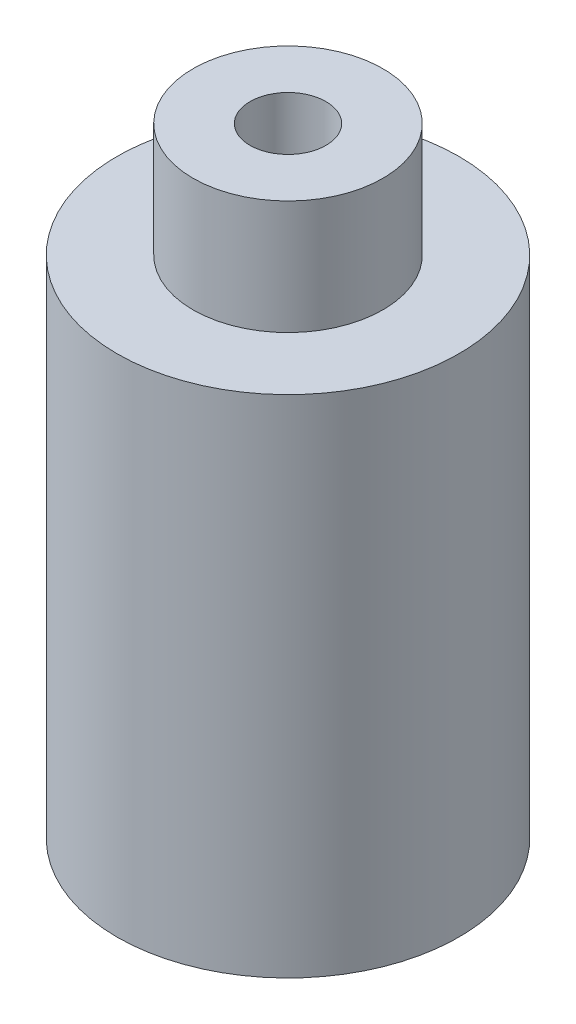
ISO-10303-21;
HEADER;
FILE_DESCRIPTION(('STEP AP214'),'2;1');
FILE_NAME('part.step','',(''),(''),'','','');
FILE_SCHEMA(('AUTOMOTIVE_DESIGN { 1 0 10303 214 1 1 1 1 }'));
ENDSEC;
DATA;
#1=APPLICATION_CONTEXT('core data for automotive mechanical design processes');
#2=APPLICATION_PROTOCOL_DEFINITION('international standard','automotive_design',2000,#1);
#3=PRODUCT_CONTEXT('',#1,'mechanical');
#4=PRODUCT('Part','Part','',(#3));
#5=PRODUCT_RELATED_PRODUCT_CATEGORY('part','',(#4));
#6=PRODUCT_DEFINITION_FORMATION('','',#4);
#7=PRODUCT_DEFINITION_CONTEXT('part definition',#1,'design');
#8=PRODUCT_DEFINITION('design','',#6,#7);
#9=PRODUCT_DEFINITION_SHAPE('','',#8);
#10=(LENGTH_UNIT() NAMED_UNIT(*) SI_UNIT(.MILLI.,.METRE.));
#11=(NAMED_UNIT(*) PLANE_ANGLE_UNIT() SI_UNIT($,.RADIAN.));
#12=(NAMED_UNIT(*) SI_UNIT($,.STERADIAN.) SOLID_ANGLE_UNIT());
#13=UNCERTAINTY_MEASURE_WITH_UNIT(LENGTH_MEASURE(1.E-05),#10,'distance_accuracy_value','');
#14=(GEOMETRIC_REPRESENTATION_CONTEXT(3) GLOBAL_UNCERTAINTY_ASSIGNED_CONTEXT((#13)) GLOBAL_UNIT_ASSIGNED_CONTEXT((#10,
#11,#12)) REPRESENTATION_CONTEXT('',''));
#15=CARTESIAN_POINT('',(0.,0.,0.));
#16=DIRECTION('',(0.,0.,1.));
#17=DIRECTION('',(1.,0.,0.));
#18=AXIS2_PLACEMENT_3D('',#15,#16,#17);
#19=CARTESIAN_POINT('',(18.,-36.7,0.));
#20=DIRECTION('',(0.,1.,0.));
#21=DIRECTION('',(0.,0.,1.));
#22=AXIS2_PLACEMENT_3D('',#19,#20,#21);
#23=CYLINDRICAL_SURFACE('',#22,1.);
#24=DIRECTION('',(0.,1.,0.));
#25=VECTOR('',#24,1.);
#26=CARTESIAN_POINT('',(18.,-36.7,1.));
#27=LINE('',#26,#25);
#28=CARTESIAN_POINT('',(18.,-24.,1.));
#29=VERTEX_POINT('',#28);
#30=CARTESIAN_POINT('',(18.,-19.5,1.));
#31=VERTEX_POINT('',#30);
#32=EDGE_CURVE('E10',#29,#31,#27,.T.);
#33=ORIENTED_EDGE('',*,*,#32,.F.);
#34=CARTESIAN_POINT('',(18.,-24.,0.));
#35=DIRECTION('',(0.,1.,0.));
#36=DIRECTION('',(0.,0.,1.));
#37=AXIS2_PLACEMENT_3D('',#34,#35,#36);
#38=CIRCLE('',#37,1.);
#39=EDGE_CURVE('E19',#29,#29,#38,.T.);
#40=ORIENTED_EDGE('',*,*,#39,.F.);
#41=ORIENTED_EDGE('',*,*,#32,.T.);
#42=CARTESIAN_POINT('',(18.,-19.5,0.));
#43=DIRECTION('',(0.,1.,0.));
#44=DIRECTION('',(0.,0.,1.));
#45=AXIS2_PLACEMENT_3D('',#42,#43,#44);
#46=CIRCLE('',#45,1.);
#47=EDGE_CURVE('E92',#31,#31,#46,.T.);
#48=ORIENTED_EDGE('',*,*,#47,.T.);
#49=EDGE_LOOP('',(#33,#40,#41,#48));
#50=FACE_BOUND('',#49,.T.);
#51=ADVANCED_FACE('F15',(#50),#23,.F.);
#52=CARTESIAN_POINT('',(18.,-24.,0.));
#53=DIRECTION('',(0.,1.,0.));
#54=DIRECTION('',(1.,0.,0.));
#55=AXIS2_PLACEMENT_3D('',#52,#53,#54);
#56=PLANE('',#55);
#57=ORIENTED_EDGE('',*,*,#39,.T.);
#58=EDGE_LOOP('',(#57));
#59=FACE_BOUND('',#58,.T.);
#60=CARTESIAN_POINT('',(18.,-24.,0.));
#61=DIRECTION('',(0.,1.,0.));
#62=DIRECTION('',(0.,0.,1.));
#63=AXIS2_PLACEMENT_3D('',#60,#61,#62);
#64=CIRCLE('',#63,2.);
#65=CARTESIAN_POINT('',(18.,-24.,2.));
#66=VERTEX_POINT('',#65);
#67=EDGE_CURVE('E68',#66,#66,#64,.T.);
#68=ORIENTED_EDGE('',*,*,#67,.F.);
#69=EDGE_LOOP('',(#68));
#70=FACE_BOUND('',#69,.T.);
#71=ADVANCED_FACE('F17',(#59,#70),#56,.F.);
#72=CARTESIAN_POINT('',(18.,-19.5,0.));
#73=DIRECTION('',(0.,1.,0.));
#74=DIRECTION('',(1.,0.,0.));
#75=AXIS2_PLACEMENT_3D('',#72,#73,#74);
#76=PLANE('',#75);
#77=ORIENTED_EDGE('',*,*,#47,.F.);
#78=EDGE_LOOP('',(#77));
#79=FACE_BOUND('',#78,.T.);
#80=CARTESIAN_POINT('',(18.,-19.5,0.));
#81=DIRECTION('',(0.,1.,0.));
#82=DIRECTION('',(0.,0.,1.));
#83=AXIS2_PLACEMENT_3D('',#80,#81,#82);
#84=CIRCLE('',#83,2.5);
#85=CARTESIAN_POINT('',(18.,-19.5,2.5));
#86=VERTEX_POINT('',#85);
#87=EDGE_CURVE('E76',#86,#86,#84,.T.);
#88=ORIENTED_EDGE('',*,*,#87,.T.);
#89=EDGE_LOOP('',(#88));
#90=FACE_BOUND('',#89,.T.);
#91=ADVANCED_FACE('F136',(#79,#90),#76,.T.);
#92=CARTESIAN_POINT('',(18.,-36.7,0.));
#93=DIRECTION('',(0.,1.,0.));
#94=DIRECTION('',(0.,0.,1.));
#95=AXIS2_PLACEMENT_3D('',#92,#93,#94);
#96=CYLINDRICAL_SURFACE('',#95,2.);
#97=CARTESIAN_POINT('',(18.,-35.8,0.));
#98=DIRECTION('',(0.,1.,0.));
#99=DIRECTION('',(0.,0.,1.));
#100=AXIS2_PLACEMENT_3D('',#97,#98,#99);
#101=CIRCLE('',#100,2.);
#102=CARTESIAN_POINT('',(18.,-35.8,2.));
#103=VERTEX_POINT('',#102);
#104=EDGE_CURVE('E66',#103,#103,#101,.T.);
#105=ORIENTED_EDGE('',*,*,#104,.F.);
#106=DIRECTION('',(0.,1.,0.));
#107=VECTOR('',#106,1.);
#108=CARTESIAN_POINT('',(18.,-36.7,2.));
#109=LINE('',#108,#107);
#110=EDGE_CURVE('E63',#103,#66,#109,.T.);
#111=ORIENTED_EDGE('',*,*,#110,.T.);
#112=ORIENTED_EDGE('',*,*,#67,.T.);
#113=ORIENTED_EDGE('',*,*,#110,.F.);
#114=EDGE_LOOP('',(#105,#111,#112,#113));
#115=FACE_BOUND('',#114,.T.);
#116=ADVANCED_FACE('F65',(#115),#96,.F.);
#117=CARTESIAN_POINT('',(18.,-22.5,0.));
#118=DIRECTION('',(0.,1.,0.));
#119=DIRECTION('',(0.,0.,1.));
#120=AXIS2_PLACEMENT_3D('',#117,#118,#119);
#121=CYLINDRICAL_SURFACE('',#120,2.5);
#122=ORIENTED_EDGE('',*,*,#87,.F.);
#123=DIRECTION('',(0.,1.,0.));
#124=VECTOR('',#123,1.);
#125=CARTESIAN_POINT('',(18.,-22.5,2.5));
#126=LINE('',#125,#124);
#127=CARTESIAN_POINT('',(18.,-22.5,2.5));
#128=VERTEX_POINT('',#127);
#129=EDGE_CURVE('E70',#128,#86,#126,.T.);
#130=ORIENTED_EDGE('',*,*,#129,.F.);
#131=CARTESIAN_POINT('',(18.,-22.5,0.));
#132=DIRECTION('',(0.,1.,0.));
#133=DIRECTION('',(0.,0.,1.));
#134=AXIS2_PLACEMENT_3D('',#131,#132,#133);
#135=CIRCLE('',#134,2.5);
#136=EDGE_CURVE('E77',#128,#128,#135,.T.);
#137=ORIENTED_EDGE('',*,*,#136,.T.);
#138=ORIENTED_EDGE('',*,*,#129,.T.);
#139=EDGE_LOOP('',(#122,#130,#137,#138));
#140=FACE_BOUND('',#139,.T.);
#141=ADVANCED_FACE('F119',(#140),#121,.T.);
#142=CARTESIAN_POINT('',(18.,-35.8,0.));
#143=DIRECTION('',(0.,1.,0.));
#144=DIRECTION('',(1.,0.,0.));
#145=AXIS2_PLACEMENT_3D('',#142,#143,#144);
#146=PLANE('',#145);
#147=ORIENTED_EDGE('',*,*,#104,.T.);
#148=EDGE_LOOP('',(#147));
#149=FACE_BOUND('',#148,.T.);
#150=CARTESIAN_POINT('',(18.,-35.8,0.));
#151=DIRECTION('',(0.,1.,0.));
#152=DIRECTION('',(0.,0.,1.));
#153=AXIS2_PLACEMENT_3D('',#150,#151,#152);
#154=CIRCLE('',#153,4.5);
#155=CARTESIAN_POINT('',(18.,-35.8,4.5));
#156=VERTEX_POINT('',#155);
#157=EDGE_CURVE('E87',#156,#156,#154,.T.);
#158=ORIENTED_EDGE('',*,*,#157,.F.);
#159=EDGE_LOOP('',(#158));
#160=FACE_BOUND('',#159,.T.);
#161=ADVANCED_FACE('F73',(#149,#160),#146,.F.);
#162=CARTESIAN_POINT('',(18.,-22.5,0.));
#163=DIRECTION('',(0.,1.,0.));
#164=DIRECTION('',(1.,0.,0.));
#165=AXIS2_PLACEMENT_3D('',#162,#163,#164);
#166=PLANE('',#165);
#167=ORIENTED_EDGE('',*,*,#136,.F.);
#168=EDGE_LOOP('',(#167));
#169=FACE_BOUND('',#168,.T.);
#170=CARTESIAN_POINT('',(18.,-22.5,0.));
#171=DIRECTION('',(0.,1.,0.));
#172=DIRECTION('',(0.,0.,1.));
#173=AXIS2_PLACEMENT_3D('',#170,#171,#172);
#174=CIRCLE('',#173,4.5);
#175=CARTESIAN_POINT('',(18.,-22.5,4.5));
#176=VERTEX_POINT('',#175);
#177=EDGE_CURVE('E104',#176,#176,#174,.T.);
#178=ORIENTED_EDGE('',*,*,#177,.T.);
#179=EDGE_LOOP('',(#178));
#180=FACE_BOUND('',#179,.T.);
#181=ADVANCED_FACE('F118',(#169,#180),#166,.T.);
#182=CARTESIAN_POINT('',(18.,-35.8,0.));
#183=DIRECTION('',(0.,1.,0.));
#184=DIRECTION('',(0.,0.,1.));
#185=AXIS2_PLACEMENT_3D('',#182,#183,#184);
#186=CYLINDRICAL_SURFACE('',#185,4.5);
#187=ORIENTED_EDGE('',*,*,#177,.F.);
#188=DIRECTION('',(0.,1.,0.));
#189=VECTOR('',#188,1.);
#190=CARTESIAN_POINT('',(18.,-35.8,4.5));
#191=LINE('',#190,#189);
#192=EDGE_CURVE('E101',#156,#176,#191,.T.);
#193=ORIENTED_EDGE('',*,*,#192,.F.);
#194=ORIENTED_EDGE('',*,*,#157,.T.);
#195=ORIENTED_EDGE('',*,*,#192,.T.);
#196=EDGE_LOOP('',(#187,#193,#194,#195));
#197=FACE_BOUND('',#196,.T.);
#198=ADVANCED_FACE('F116',(#197),#186,.T.);
#199=CLOSED_SHELL('',(#51,#71,#91,#116,#141,#161,#181,#198));
#200=MANIFOLD_SOLID_BREP('B1',#199);
#201=ADVANCED_BREP_SHAPE_REPRESENTATION('',(#18,#200),#14);
#202=SHAPE_DEFINITION_REPRESENTATION(#9,#201);
ENDSEC;
END-ISO-10303-21;
